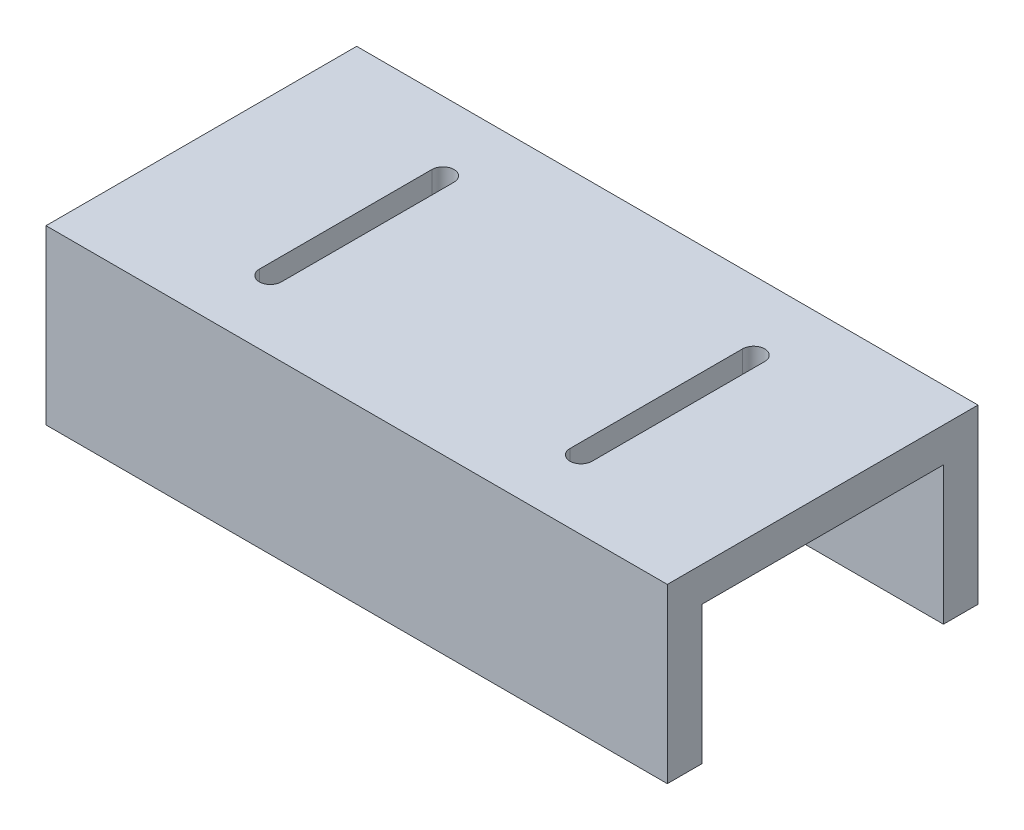
ISO-10303-21;
HEADER;
FILE_DESCRIPTION(('STEP AP214'),'2;1');
FILE_NAME('part.step','',(''),(''),'','','');
FILE_SCHEMA(('AUTOMOTIVE_DESIGN { 1 0 10303 214 1 1 1 1 }'));
ENDSEC;
DATA;
#1=APPLICATION_CONTEXT('core data for automotive mechanical design processes');
#2=APPLICATION_PROTOCOL_DEFINITION('international standard','automotive_design',2000,#1);
#3=PRODUCT_CONTEXT('',#1,'mechanical');
#4=PRODUCT('Part','Part','',(#3));
#5=PRODUCT_RELATED_PRODUCT_CATEGORY('part','',(#4));
#6=PRODUCT_DEFINITION_FORMATION('','',#4);
#7=PRODUCT_DEFINITION_CONTEXT('part definition',#1,'design');
#8=PRODUCT_DEFINITION('design','',#6,#7);
#9=PRODUCT_DEFINITION_SHAPE('','',#8);
#10=(LENGTH_UNIT() NAMED_UNIT(*) SI_UNIT(.MILLI.,.METRE.));
#11=(NAMED_UNIT(*) PLANE_ANGLE_UNIT() SI_UNIT($,.RADIAN.));
#12=(NAMED_UNIT(*) SI_UNIT($,.STERADIAN.) SOLID_ANGLE_UNIT());
#13=UNCERTAINTY_MEASURE_WITH_UNIT(LENGTH_MEASURE(1.E-05),#10,'distance_accuracy_value','');
#14=(GEOMETRIC_REPRESENTATION_CONTEXT(3) GLOBAL_UNCERTAINTY_ASSIGNED_CONTEXT((#13)) GLOBAL_UNIT_ASSIGNED_CONTEXT((#10,
#11,#12)) REPRESENTATION_CONTEXT('',''));
#15=CARTESIAN_POINT('',(0.,0.,0.));
#16=DIRECTION('',(0.,0.,1.));
#17=DIRECTION('',(1.,0.,0.));
#18=AXIS2_PLACEMENT_3D('',#15,#16,#17);
#19=CARTESIAN_POINT('',(25.,-1.5,3.));
#20=DIRECTION('',(0.,0.,1.));
#21=DIRECTION('',(1.,0.,0.));
#22=AXIS2_PLACEMENT_3D('',#19,#20,#21);
#23=PLANE('',#22);
#24=CARTESIAN_POINT('',(25.,-1.5,3.));
#25=DIRECTION('',(0.,0.,1.));
#26=DIRECTION('',(1.,0.,0.));
#27=AXIS2_PLACEMENT_3D('',#24,#25,#26);
#28=CIRCLE('',#27,1.6);
#29=CARTESIAN_POINT('',(26.6,-1.5,3.));
#30=VERTEX_POINT('',#29);
#31=EDGE_CURVE('E338',#30,#30,#28,.T.);
#32=ORIENTED_EDGE('',*,*,#31,.F.);
#33=EDGE_LOOP('',(#32));
#34=FACE_BOUND('',#33,.T.);
#35=CARTESIAN_POINT('',(25.,-1.5,3.));
#36=DIRECTION('',(0.,0.,1.));
#37=DIRECTION('',(1.,0.,0.));
#38=AXIS2_PLACEMENT_3D('',#35,#36,#37);
#39=CIRCLE('',#38,3.);
#40=CARTESIAN_POINT('',(28.,-1.5,3.));
#41=VERTEX_POINT('',#40);
#42=EDGE_CURVE('E34',#41,#41,#39,.T.);
#43=ORIENTED_EDGE('',*,*,#42,.T.);
#44=EDGE_LOOP('',(#43));
#45=FACE_BOUND('',#44,.T.);
#46=ADVANCED_FACE('F15',(#34,#45),#23,.T.);
#47=CARTESIAN_POINT('',(-25.,-1.5,3.));
#48=DIRECTION('',(0.,0.,1.));
#49=DIRECTION('',(1.,0.,0.));
#50=AXIS2_PLACEMENT_3D('',#47,#48,#49);
#51=PLANE('',#50);
#52=CARTESIAN_POINT('',(-25.,-1.5,3.));
#53=DIRECTION('',(0.,0.,1.));
#54=DIRECTION('',(1.,0.,0.));
#55=AXIS2_PLACEMENT_3D('',#52,#53,#54);
#56=CIRCLE('',#55,1.6);
#57=CARTESIAN_POINT('',(-23.4,-1.5,3.));
#58=VERTEX_POINT('',#57);
#59=EDGE_CURVE('E339',#58,#58,#56,.T.);
#60=ORIENTED_EDGE('',*,*,#59,.F.);
#61=EDGE_LOOP('',(#60));
#62=FACE_BOUND('',#61,.T.);
#63=CARTESIAN_POINT('',(-25.,-1.5,3.));
#64=DIRECTION('',(0.,0.,1.));
#65=DIRECTION('',(1.,0.,0.));
#66=AXIS2_PLACEMENT_3D('',#63,#64,#65);
#67=CIRCLE('',#66,3.);
#68=CARTESIAN_POINT('',(-22.,-1.5,3.));
#69=VERTEX_POINT('',#68);
#70=EDGE_CURVE('E41',#69,#69,#67,.T.);
#71=ORIENTED_EDGE('',*,*,#70,.T.);
#72=EDGE_LOOP('',(#71));
#73=FACE_BOUND('',#72,.T.);
#74=ADVANCED_FACE('F453',(#62,#73),#51,.T.);
#75=CARTESIAN_POINT('',(22.5,-12.5,35.));
#76=DIRECTION('',(0.,-1.,0.));
#77=DIRECTION('',(1.,0.,0.));
#78=AXIS2_PLACEMENT_3D('',#75,#76,#77);
#79=CYLINDRICAL_SURFACE('',#78,1.6);
#80=DIRECTION('',(0.,1.,0.));
#81=VECTOR('',#80,1.);
#82=CARTESIAN_POINT('',(20.9,-12.5,35.));
#83=LINE('',#82,#81);
#84=CARTESIAN_POINT('',(20.9,7.5,35.));
#85=VERTEX_POINT('',#84);
#86=CARTESIAN_POINT('',(20.9,12.5,35.));
#87=VERTEX_POINT('',#86);
#88=EDGE_CURVE('E10',#85,#87,#83,.T.);
#89=ORIENTED_EDGE('',*,*,#88,.T.);
#90=CARTESIAN_POINT('',(22.5,12.5,35.));
#91=DIRECTION('',(0.,-1.,0.));
#92=DIRECTION('',(1.,0.,0.));
#93=AXIS2_PLACEMENT_3D('',#90,#91,#92);
#94=CIRCLE('',#93,1.6);
#95=CARTESIAN_POINT('',(24.1,12.5,35.));
#96=VERTEX_POINT('',#95);
#97=EDGE_CURVE('E242',#96,#87,#94,.T.);
#98=ORIENTED_EDGE('',*,*,#97,.F.);
#99=DIRECTION('',(0.,1.,0.));
#100=VECTOR('',#99,1.);
#101=CARTESIAN_POINT('',(24.1,-12.5,35.));
#102=LINE('',#101,#100);
#103=CARTESIAN_POINT('',(24.1,7.5,35.));
#104=VERTEX_POINT('',#103);
#105=EDGE_CURVE('E410',#104,#96,#102,.T.);
#106=ORIENTED_EDGE('',*,*,#105,.F.);
#107=CARTESIAN_POINT('',(22.5,7.5,35.));
#108=DIRECTION('',(0.,-1.,0.));
#109=DIRECTION('',(1.,0.,0.));
#110=AXIS2_PLACEMENT_3D('',#107,#108,#109);
#111=CIRCLE('',#110,1.6);
#112=EDGE_CURVE('E269',#104,#85,#111,.T.);
#113=ORIENTED_EDGE('',*,*,#112,.T.);
#114=EDGE_LOOP('',(#89,#98,#106,#113));
#115=FACE_BOUND('',#114,.T.);
#116=ADVANCED_FACE('F432',(#115),#79,.F.);
#117=CARTESIAN_POINT('',(20.9,-12.5,35.));
#118=DIRECTION('',(-1.,0.,0.));
#119=DIRECTION('',(0.,0.,1.));
#120=AXIS2_PLACEMENT_3D('',#117,#118,#119);
#121=PLANE('',#120);
#122=DIRECTION('',(0.,1.,0.));
#123=VECTOR('',#122,1.);
#124=CARTESIAN_POINT('',(20.9,-12.5,10.));
#125=LINE('',#124,#123);
#126=CARTESIAN_POINT('',(20.9,7.5,10.));
#127=VERTEX_POINT('',#126);
#128=CARTESIAN_POINT('',(20.9,12.5,10.));
#129=VERTEX_POINT('',#128);
#130=EDGE_CURVE('E18',#127,#129,#125,.T.);
#131=ORIENTED_EDGE('',*,*,#130,.T.);
#132=DIRECTION('',(0.,0.,-1.));
#133=VECTOR('',#132,1.);
#134=CARTESIAN_POINT('',(20.9,12.5,17.5));
#135=LINE('',#134,#133);
#136=EDGE_CURVE('E361',#87,#129,#135,.T.);
#137=ORIENTED_EDGE('',*,*,#136,.F.);
#138=ORIENTED_EDGE('',*,*,#88,.F.);
#139=DIRECTION('',(0.,0.,1.));
#140=VECTOR('',#139,1.);
#141=CARTESIAN_POINT('',(20.9,7.5,28.75));
#142=LINE('',#141,#140);
#143=EDGE_CURVE('E274',#127,#85,#142,.T.);
#144=ORIENTED_EDGE('',*,*,#143,.F.);
#145=EDGE_LOOP('',(#131,#137,#138,#144));
#146=FACE_BOUND('',#145,.T.);
#147=ADVANCED_FACE('F423',(#146),#121,.F.);
#148=CARTESIAN_POINT('',(22.5,-12.5,10.));
#149=DIRECTION('',(0.,-1.,0.));
#150=DIRECTION('',(1.,0.,0.));
#151=AXIS2_PLACEMENT_3D('',#148,#149,#150);
#152=CYLINDRICAL_SURFACE('',#151,1.6);
#153=DIRECTION('',(0.,1.,0.));
#154=VECTOR('',#153,1.);
#155=CARTESIAN_POINT('',(24.1,-12.5,10.));
#156=LINE('',#155,#154);
#157=CARTESIAN_POINT('',(24.1,7.5,10.));
#158=VERTEX_POINT('',#157);
#159=CARTESIAN_POINT('',(24.1,12.5,10.));
#160=VERTEX_POINT('',#159);
#161=EDGE_CURVE('E412',#158,#160,#156,.T.);
#162=ORIENTED_EDGE('',*,*,#161,.T.);
#163=CARTESIAN_POINT('',(22.5,12.5,10.));
#164=DIRECTION('',(0.,-1.,0.));
#165=DIRECTION('',(1.,0.,0.));
#166=AXIS2_PLACEMENT_3D('',#163,#164,#165);
#167=CIRCLE('',#166,1.6);
#168=EDGE_CURVE('E365',#129,#160,#167,.T.);
#169=ORIENTED_EDGE('',*,*,#168,.F.);
#170=ORIENTED_EDGE('',*,*,#130,.F.);
#171=CARTESIAN_POINT('',(22.5,7.5,10.));
#172=DIRECTION('',(0.,-1.,0.));
#173=DIRECTION('',(1.,0.,0.));
#174=AXIS2_PLACEMENT_3D('',#171,#172,#173);
#175=CIRCLE('',#174,1.6);
#176=EDGE_CURVE('E282',#127,#158,#175,.T.);
#177=ORIENTED_EDGE('',*,*,#176,.T.);
#178=EDGE_LOOP('',(#162,#169,#170,#177));
#179=FACE_BOUND('',#178,.T.);
#180=ADVANCED_FACE('F425',(#179),#152,.F.);
#181=CARTESIAN_POINT('',(24.1,-12.5,35.));
#182=DIRECTION('',(-1.,0.,0.));
#183=DIRECTION('',(0.,0.,1.));
#184=AXIS2_PLACEMENT_3D('',#181,#182,#183);
#185=PLANE('',#184);
#186=DIRECTION('',(0.,0.,1.));
#187=VECTOR('',#186,1.);
#188=CARTESIAN_POINT('',(24.1,7.5,28.75));
#189=LINE('',#188,#187);
#190=EDGE_CURVE('E273',#158,#104,#189,.T.);
#191=ORIENTED_EDGE('',*,*,#190,.T.);
#192=ORIENTED_EDGE('',*,*,#105,.T.);
#193=DIRECTION('',(0.,0.,-1.));
#194=VECTOR('',#193,1.);
#195=CARTESIAN_POINT('',(24.1,12.5,17.5));
#196=LINE('',#195,#194);
#197=EDGE_CURVE('E369',#96,#160,#196,.T.);
#198=ORIENTED_EDGE('',*,*,#197,.T.);
#199=ORIENTED_EDGE('',*,*,#161,.F.);
#200=EDGE_LOOP('',(#191,#192,#198,#199));
#201=FACE_BOUND('',#200,.T.);
#202=ADVANCED_FACE('F439',(#201),#185,.T.);
#203=CARTESIAN_POINT('',(-22.5,-12.5,35.));
#204=DIRECTION('',(0.,-1.,0.));
#205=DIRECTION('',(1.,0.,0.));
#206=AXIS2_PLACEMENT_3D('',#203,#204,#205);
#207=CYLINDRICAL_SURFACE('',#206,1.6);
#208=DIRECTION('',(0.,1.,0.));
#209=VECTOR('',#208,1.);
#210=CARTESIAN_POINT('',(-24.1,-12.5,35.));
#211=LINE('',#210,#209);
#212=CARTESIAN_POINT('',(-24.1,7.5,35.));
#213=VERTEX_POINT('',#212);
#214=CARTESIAN_POINT('',(-24.1,12.5,35.));
#215=VERTEX_POINT('',#214);
#216=EDGE_CURVE('E407',#213,#215,#211,.T.);
#217=ORIENTED_EDGE('',*,*,#216,.T.);
#218=CARTESIAN_POINT('',(-22.5,12.5,35.));
#219=DIRECTION('',(0.,-1.,0.));
#220=DIRECTION('',(1.,0.,0.));
#221=AXIS2_PLACEMENT_3D('',#218,#219,#220);
#222=CIRCLE('',#221,1.6);
#223=CARTESIAN_POINT('',(-20.9,12.5,35.));
#224=VERTEX_POINT('',#223);
#225=EDGE_CURVE('E379',#224,#215,#222,.T.);
#226=ORIENTED_EDGE('',*,*,#225,.F.);
#227=DIRECTION('',(0.,1.,0.));
#228=VECTOR('',#227,1.);
#229=CARTESIAN_POINT('',(-20.9,-12.5,35.));
#230=LINE('',#229,#228);
#231=CARTESIAN_POINT('',(-20.9,7.5,35.));
#232=VERTEX_POINT('',#231);
#233=EDGE_CURVE('E398',#232,#224,#230,.T.);
#234=ORIENTED_EDGE('',*,*,#233,.F.);
#235=CARTESIAN_POINT('',(-22.5,7.5,35.));
#236=DIRECTION('',(0.,-1.,0.));
#237=DIRECTION('',(1.,0.,0.));
#238=AXIS2_PLACEMENT_3D('',#235,#236,#237);
#239=CIRCLE('',#238,1.6);
#240=EDGE_CURVE('E321',#232,#213,#239,.T.);
#241=ORIENTED_EDGE('',*,*,#240,.T.);
#242=EDGE_LOOP('',(#217,#226,#234,#241));
#243=FACE_BOUND('',#242,.T.);
#244=ADVANCED_FACE('F441',(#243),#207,.F.);
#245=CARTESIAN_POINT('',(-24.1,-12.5,35.));
#246=DIRECTION('',(-1.,0.,0.));
#247=DIRECTION('',(0.,0.,1.));
#248=AXIS2_PLACEMENT_3D('',#245,#246,#247);
#249=PLANE('',#248);
#250=DIRECTION('',(0.,1.,0.));
#251=VECTOR('',#250,1.);
#252=CARTESIAN_POINT('',(-24.1,-12.5,10.));
#253=LINE('',#252,#251);
#254=CARTESIAN_POINT('',(-24.1,7.5,10.));
#255=VERTEX_POINT('',#254);
#256=CARTESIAN_POINT('',(-24.1,12.5,10.));
#257=VERTEX_POINT('',#256);
#258=EDGE_CURVE('E404',#255,#257,#253,.T.);
#259=ORIENTED_EDGE('',*,*,#258,.T.);
#260=DIRECTION('',(0.,0.,-1.));
#261=VECTOR('',#260,1.);
#262=CARTESIAN_POINT('',(-24.1,12.5,17.5));
#263=LINE('',#262,#261);
#264=EDGE_CURVE('E237',#215,#257,#263,.T.);
#265=ORIENTED_EDGE('',*,*,#264,.F.);
#266=ORIENTED_EDGE('',*,*,#216,.F.);
#267=DIRECTION('',(0.,0.,1.));
#268=VECTOR('',#267,1.);
#269=CARTESIAN_POINT('',(-24.1,7.5,28.75));
#270=LINE('',#269,#268);
#271=EDGE_CURVE('E317',#255,#213,#270,.T.);
#272=ORIENTED_EDGE('',*,*,#271,.F.);
#273=EDGE_LOOP('',(#259,#265,#266,#272));
#274=FACE_BOUND('',#273,.T.);
#275=ADVANCED_FACE('F448',(#274),#249,.F.);
#276=CARTESIAN_POINT('',(-22.5,-12.5,10.));
#277=DIRECTION('',(0.,-1.,0.));
#278=DIRECTION('',(1.,0.,0.));
#279=AXIS2_PLACEMENT_3D('',#276,#277,#278);
#280=CYLINDRICAL_SURFACE('',#279,1.6);
#281=DIRECTION('',(0.,1.,0.));
#282=VECTOR('',#281,1.);
#283=CARTESIAN_POINT('',(-20.9,-12.5,10.));
#284=LINE('',#283,#282);
#285=CARTESIAN_POINT('',(-20.9,7.5,10.));
#286=VERTEX_POINT('',#285);
#287=CARTESIAN_POINT('',(-20.9,12.5,10.));
#288=VERTEX_POINT('',#287);
#289=EDGE_CURVE('E401',#286,#288,#284,.T.);
#290=ORIENTED_EDGE('',*,*,#289,.T.);
#291=CARTESIAN_POINT('',(-22.5,12.5,10.));
#292=DIRECTION('',(0.,-1.,0.));
#293=DIRECTION('',(1.,0.,0.));
#294=AXIS2_PLACEMENT_3D('',#291,#292,#293);
#295=CIRCLE('',#294,1.6);
#296=EDGE_CURVE('E241',#257,#288,#295,.T.);
#297=ORIENTED_EDGE('',*,*,#296,.F.);
#298=ORIENTED_EDGE('',*,*,#258,.F.);
#299=CARTESIAN_POINT('',(-22.5,7.5,10.));
#300=DIRECTION('',(0.,-1.,0.));
#301=DIRECTION('',(1.,0.,0.));
#302=AXIS2_PLACEMENT_3D('',#299,#300,#301);
#303=CIRCLE('',#302,1.6);
#304=EDGE_CURVE('E313',#255,#286,#303,.T.);
#305=ORIENTED_EDGE('',*,*,#304,.T.);
#306=EDGE_LOOP('',(#290,#297,#298,#305));
#307=FACE_BOUND('',#306,.T.);
#308=ADVANCED_FACE('F504',(#307),#280,.F.);
#309=CARTESIAN_POINT('',(-20.9,-12.5,35.));
#310=DIRECTION('',(-1.,0.,0.));
#311=DIRECTION('',(0.,0.,1.));
#312=AXIS2_PLACEMENT_3D('',#309,#310,#311);
#313=PLANE('',#312);
#314=DIRECTION('',(0.,0.,1.));
#315=VECTOR('',#314,1.);
#316=CARTESIAN_POINT('',(-20.9,7.5,28.75));
#317=LINE('',#316,#315);
#318=EDGE_CURVE('E286',#286,#232,#317,.T.);
#319=ORIENTED_EDGE('',*,*,#318,.T.);
#320=ORIENTED_EDGE('',*,*,#233,.T.);
#321=DIRECTION('',(0.,0.,-1.));
#322=VECTOR('',#321,1.);
#323=CARTESIAN_POINT('',(-20.9,12.5,17.5));
#324=LINE('',#323,#322);
#325=EDGE_CURVE('E281',#224,#288,#324,.T.);
#326=ORIENTED_EDGE('',*,*,#325,.T.);
#327=ORIENTED_EDGE('',*,*,#289,.F.);
#328=EDGE_LOOP('',(#319,#320,#326,#327));
#329=FACE_BOUND('',#328,.T.);
#330=ADVANCED_FACE('F502',(#329),#313,.T.);
#331=CARTESIAN_POINT('',(25.,-1.5,5.));
#332=DIRECTION('',(0.,0.,-1.));
#333=DIRECTION('',(1.,0.,0.));
#334=AXIS2_PLACEMENT_3D('',#331,#332,#333);
#335=CYLINDRICAL_SURFACE('',#334,3.);
#336=DIRECTION('',(0.,0.,-1.));
#337=VECTOR('',#336,1.);
#338=CARTESIAN_POINT('',(28.,-1.5,5.));
#339=LINE('',#338,#337);
#340=CARTESIAN_POINT('',(28.,-1.5,5.));
#341=VERTEX_POINT('',#340);
#342=EDGE_CURVE('E348',#341,#41,#339,.T.);
#343=ORIENTED_EDGE('',*,*,#342,.F.);
#344=CARTESIAN_POINT('',(25.,-1.5,5.));
#345=DIRECTION('',(0.,0.,1.));
#346=DIRECTION('',(1.,0.,0.));
#347=AXIS2_PLACEMENT_3D('',#344,#345,#346);
#348=CIRCLE('',#347,3.);
#349=EDGE_CURVE('E303',#341,#341,#348,.T.);
#350=ORIENTED_EDGE('',*,*,#349,.T.);
#351=ORIENTED_EDGE('',*,*,#342,.T.);
#352=ORIENTED_EDGE('',*,*,#42,.F.);
#353=EDGE_LOOP('',(#343,#350,#351,#352));
#354=FACE_BOUND('',#353,.T.);
#355=ADVANCED_FACE('F499',(#354),#335,.F.);
#356=CARTESIAN_POINT('',(-25.,-1.5,5.));
#357=DIRECTION('',(0.,0.,-1.));
#358=DIRECTION('',(1.,0.,0.));
#359=AXIS2_PLACEMENT_3D('',#356,#357,#358);
#360=CYLINDRICAL_SURFACE('',#359,3.);
#361=DIRECTION('',(0.,0.,-1.));
#362=VECTOR('',#361,1.);
#363=CARTESIAN_POINT('',(-22.,-1.5,5.));
#364=LINE('',#363,#362);
#365=CARTESIAN_POINT('',(-22.,-1.5,5.));
#366=VERTEX_POINT('',#365);
#367=EDGE_CURVE('E390',#366,#69,#364,.T.);
#368=ORIENTED_EDGE('',*,*,#367,.F.);
#369=CARTESIAN_POINT('',(-25.,-1.5,5.));
#370=DIRECTION('',(0.,0.,1.));
#371=DIRECTION('',(1.,0.,0.));
#372=AXIS2_PLACEMENT_3D('',#369,#370,#371);
#373=CIRCLE('',#372,3.);
#374=EDGE_CURVE('E300',#366,#366,#373,.T.);
#375=ORIENTED_EDGE('',*,*,#374,.T.);
#376=ORIENTED_EDGE('',*,*,#367,.T.);
#377=ORIENTED_EDGE('',*,*,#70,.F.);
#378=EDGE_LOOP('',(#368,#375,#376,#377));
#379=FACE_BOUND('',#378,.T.);
#380=ADVANCED_FACE('F482',(#379),#360,.F.);
#381=CARTESIAN_POINT('',(25.,-1.5,3.));
#382=DIRECTION('',(0.,0.,-1.));
#383=DIRECTION('',(1.,0.,0.));
#384=AXIS2_PLACEMENT_3D('',#381,#382,#383);
#385=CYLINDRICAL_SURFACE('',#384,1.6);
#386=DIRECTION('',(0.,0.,-1.));
#387=VECTOR('',#386,1.);
#388=CARTESIAN_POINT('',(26.6,-1.5,3.));
#389=LINE('',#388,#387);
#390=CARTESIAN_POINT('',(26.6,-1.5,0.));
#391=VERTEX_POINT('',#390);
#392=EDGE_CURVE('E335',#30,#391,#389,.T.);
#393=ORIENTED_EDGE('',*,*,#392,.F.);
#394=ORIENTED_EDGE('',*,*,#31,.T.);
#395=ORIENTED_EDGE('',*,*,#392,.T.);
#396=CARTESIAN_POINT('',(25.,-1.5,0.));
#397=DIRECTION('',(0.,0.,-1.));
#398=DIRECTION('',(1.,0.,0.));
#399=AXIS2_PLACEMENT_3D('',#396,#397,#398);
#400=CIRCLE('',#399,1.6);
#401=EDGE_CURVE('E264',#391,#391,#400,.T.);
#402=ORIENTED_EDGE('',*,*,#401,.T.);
#403=EDGE_LOOP('',(#393,#394,#395,#402));
#404=FACE_BOUND('',#403,.T.);
#405=ADVANCED_FACE('F462',(#404),#385,.F.);
#406=CARTESIAN_POINT('',(-25.,-1.5,3.));
#407=DIRECTION('',(0.,0.,-1.));
#408=DIRECTION('',(1.,0.,0.));
#409=AXIS2_PLACEMENT_3D('',#406,#407,#408);
#410=CYLINDRICAL_SURFACE('',#409,1.6);
#411=DIRECTION('',(0.,0.,-1.));
#412=VECTOR('',#411,1.);
#413=CARTESIAN_POINT('',(-23.4,-1.5,3.));
#414=LINE('',#413,#412);
#415=CARTESIAN_POINT('',(-23.4,-1.5,0.));
#416=VERTEX_POINT('',#415);
#417=EDGE_CURVE('E383',#58,#416,#414,.T.);
#418=ORIENTED_EDGE('',*,*,#417,.F.);
#419=ORIENTED_EDGE('',*,*,#59,.T.);
#420=ORIENTED_EDGE('',*,*,#417,.T.);
#421=CARTESIAN_POINT('',(-25.,-1.5,0.));
#422=DIRECTION('',(0.,0.,-1.));
#423=DIRECTION('',(1.,0.,0.));
#424=AXIS2_PLACEMENT_3D('',#421,#422,#423);
#425=CIRCLE('',#424,1.6);
#426=EDGE_CURVE('E209',#416,#416,#425,.T.);
#427=ORIENTED_EDGE('',*,*,#426,.T.);
#428=EDGE_LOOP('',(#418,#419,#420,#427));
#429=FACE_BOUND('',#428,.T.);
#430=ADVANCED_FACE('F471',(#429),#410,.F.);
#431=CARTESIAN_POINT('',(45.,-12.5,0.));
#432=DIRECTION('',(-1.,0.,0.));
#433=DIRECTION('',(0.,0.,1.));
#434=AXIS2_PLACEMENT_3D('',#431,#432,#433);
#435=PLANE('',#434);
#436=DIRECTION('',(0.,0.,1.));
#437=VECTOR('',#436,1.);
#438=CARTESIAN_POINT('',(45.,12.5,0.));
#439=LINE('',#438,#437);
#440=CARTESIAN_POINT('',(45.,12.5,0.));
#441=VERTEX_POINT('',#440);
#442=CARTESIAN_POINT('',(45.,12.5,45.));
#443=VERTEX_POINT('',#442);
#444=EDGE_CURVE('E358',#441,#443,#439,.T.);
#445=ORIENTED_EDGE('',*,*,#444,.T.);
#446=DIRECTION('',(0.,1.,0.));
#447=VECTOR('',#446,1.);
#448=CARTESIAN_POINT('',(45.,-12.5,45.));
#449=LINE('',#448,#447);
#450=CARTESIAN_POINT('',(45.,-12.5,45.));
#451=VERTEX_POINT('',#450);
#452=EDGE_CURVE('E347',#451,#443,#449,.T.);
#453=ORIENTED_EDGE('',*,*,#452,.F.);
#454=DIRECTION('',(0.,0.,1.));
#455=VECTOR('',#454,1.);
#456=CARTESIAN_POINT('',(45.,-12.5,0.));
#457=LINE('',#456,#455);
#458=CARTESIAN_POINT('',(45.,-12.5,40.));
#459=VERTEX_POINT('',#458);
#460=EDGE_CURVE('E291',#459,#451,#457,.T.);
#461=ORIENTED_EDGE('',*,*,#460,.F.);
#462=DIRECTION('',(0.,1.,0.));
#463=VECTOR('',#462,1.);
#464=CARTESIAN_POINT('',(45.,-12.5,40.));
#465=LINE('',#464,#463);
#466=CARTESIAN_POINT('',(45.,7.5,40.));
#467=VERTEX_POINT('',#466);
#468=EDGE_CURVE('E296',#459,#467,#465,.T.);
#469=ORIENTED_EDGE('',*,*,#468,.T.);
#470=DIRECTION('',(0.,0.,1.));
#471=VECTOR('',#470,1.);
#472=CARTESIAN_POINT('',(45.,7.5,5.));
#473=LINE('',#472,#471);
#474=CARTESIAN_POINT('',(45.,7.5,5.));
#475=VERTEX_POINT('',#474);
#476=EDGE_CURVE('E308',#475,#467,#473,.T.);
#477=ORIENTED_EDGE('',*,*,#476,.F.);
#478=DIRECTION('',(0.,1.,0.));
#479=VECTOR('',#478,1.);
#480=CARTESIAN_POINT('',(45.,-12.5,5.));
#481=LINE('',#480,#479);
#482=CARTESIAN_POINT('',(45.,-12.5,5.));
#483=VERTEX_POINT('',#482);
#484=EDGE_CURVE('E259',#483,#475,#481,.T.);
#485=ORIENTED_EDGE('',*,*,#484,.F.);
#486=DIRECTION('',(0.,0.,1.));
#487=VECTOR('',#486,1.);
#488=CARTESIAN_POINT('',(45.,-12.5,0.));
#489=LINE('',#488,#487);
#490=CARTESIAN_POINT('',(45.,-12.5,0.));
#491=VERTEX_POINT('',#490);
#492=EDGE_CURVE('E260',#491,#483,#489,.T.);
#493=ORIENTED_EDGE('',*,*,#492,.F.);
#494=DIRECTION('',(0.,1.,0.));
#495=VECTOR('',#494,1.);
#496=CARTESIAN_POINT('',(45.,-12.5,0.));
#497=LINE('',#496,#495);
#498=EDGE_CURVE('E204',#491,#441,#497,.T.);
#499=ORIENTED_EDGE('',*,*,#498,.T.);
#500=EDGE_LOOP('',(#445,#453,#461,#469,#477,#485,#493,#499));
#501=FACE_BOUND('',#500,.T.);
#502=ADVANCED_FACE('F474',(#501),#435,.F.);
#503=CARTESIAN_POINT('',(45.,12.5,0.));
#504=DIRECTION('',(0.,-1.,0.));
#505=DIRECTION('',(0.,0.,-1.));
#506=AXIS2_PLACEMENT_3D('',#503,#504,#505);
#507=PLANE('',#506);
#508=ORIENTED_EDGE('',*,*,#264,.T.);
#509=ORIENTED_EDGE('',*,*,#296,.T.);
#510=ORIENTED_EDGE('',*,*,#325,.F.);
#511=ORIENTED_EDGE('',*,*,#225,.T.);
#512=EDGE_LOOP('',(#508,#509,#510,#511));
#513=FACE_BOUND('',#512,.T.);
#514=ORIENTED_EDGE('',*,*,#136,.T.);
#515=ORIENTED_EDGE('',*,*,#168,.T.);
#516=ORIENTED_EDGE('',*,*,#197,.F.);
#517=ORIENTED_EDGE('',*,*,#97,.T.);
#518=EDGE_LOOP('',(#514,#515,#516,#517));
#519=FACE_BOUND('',#518,.T.);
#520=DIRECTION('',(-1.,0.,0.));
#521=VECTOR('',#520,1.);
#522=CARTESIAN_POINT('',(45.,12.5,0.));
#523=LINE('',#522,#521);
#524=CARTESIAN_POINT('',(-45.,12.5,0.));
#525=VERTEX_POINT('',#524);
#526=EDGE_CURVE('E220',#441,#525,#523,.T.);
#527=ORIENTED_EDGE('',*,*,#526,.T.);
#528=DIRECTION('',(0.,0.,1.));
#529=VECTOR('',#528,1.);
#530=CARTESIAN_POINT('',(-45.,12.5,0.));
#531=LINE('',#530,#529);
#532=CARTESIAN_POINT('',(-45.,12.5,45.));
#533=VERTEX_POINT('',#532);
#534=EDGE_CURVE('E218',#525,#533,#531,.T.);
#535=ORIENTED_EDGE('',*,*,#534,.T.);
#536=DIRECTION('',(-1.,0.,0.));
#537=VECTOR('',#536,1.);
#538=CARTESIAN_POINT('',(45.,12.5,45.));
#539=LINE('',#538,#537);
#540=EDGE_CURVE('E355',#443,#533,#539,.T.);
#541=ORIENTED_EDGE('',*,*,#540,.F.);
#542=ORIENTED_EDGE('',*,*,#444,.F.);
#543=EDGE_LOOP('',(#527,#535,#541,#542));
#544=FACE_BOUND('',#543,.T.);
#545=ADVANCED_FACE('F428',(#513,#519,#544),#507,.F.);
#546=CARTESIAN_POINT('',(0.,0.,45.));
#547=DIRECTION('',(0.,0.,1.));
#548=DIRECTION('',(1.,0.,0.));
#549=AXIS2_PLACEMENT_3D('',#546,#547,#548);
#550=PLANE('',#549);
#551=DIRECTION('',(0.,-1.,0.));
#552=VECTOR('',#551,1.);
#553=CARTESIAN_POINT('',(-45.,12.5,45.));
#554=LINE('',#553,#552);
#555=CARTESIAN_POINT('',(-45.,-12.5,45.));
#556=VERTEX_POINT('',#555);
#557=EDGE_CURVE('E243',#533,#556,#554,.T.);
#558=ORIENTED_EDGE('',*,*,#557,.T.);
#559=DIRECTION('',(1.,0.,0.));
#560=VECTOR('',#559,1.);
#561=CARTESIAN_POINT('',(-45.,-12.5,45.));
#562=LINE('',#561,#560);
#563=EDGE_CURVE('E295',#556,#451,#562,.T.);
#564=ORIENTED_EDGE('',*,*,#563,.T.);
#565=ORIENTED_EDGE('',*,*,#452,.T.);
#566=ORIENTED_EDGE('',*,*,#540,.T.);
#567=EDGE_LOOP('',(#558,#564,#565,#566));
#568=FACE_BOUND('',#567,.T.);
#569=ADVANCED_FACE('F494',(#568),#550,.T.);
#570=CARTESIAN_POINT('',(-45.,-12.5,0.));
#571=DIRECTION('',(0.,1.,0.));
#572=DIRECTION('',(1.,0.,0.));
#573=AXIS2_PLACEMENT_3D('',#570,#571,#572);
#574=PLANE('',#573);
#575=ORIENTED_EDGE('',*,*,#460,.T.);
#576=ORIENTED_EDGE('',*,*,#563,.F.);
#577=DIRECTION('',(0.,0.,1.));
#578=VECTOR('',#577,1.);
#579=CARTESIAN_POINT('',(-45.,-12.5,0.));
#580=LINE('',#579,#578);
#581=CARTESIAN_POINT('',(-45.,-12.5,40.));
#582=VERTEX_POINT('',#581);
#583=EDGE_CURVE('E247',#582,#556,#580,.T.);
#584=ORIENTED_EDGE('',*,*,#583,.F.);
#585=DIRECTION('',(-1.,0.,0.));
#586=VECTOR('',#585,1.);
#587=CARTESIAN_POINT('',(45.,-12.5,40.));
#588=LINE('',#587,#586);
#589=EDGE_CURVE('E334',#459,#582,#588,.T.);
#590=ORIENTED_EDGE('',*,*,#589,.F.);
#591=EDGE_LOOP('',(#575,#576,#584,#590));
#592=FACE_BOUND('',#591,.T.);
#593=ADVANCED_FACE('F489',(#592),#574,.F.);
#594=CARTESIAN_POINT('',(45.,-12.5,40.));
#595=DIRECTION('',(0.,0.,1.));
#596=DIRECTION('',(0.,-1.,0.));
#597=AXIS2_PLACEMENT_3D('',#594,#595,#596);
#598=PLANE('',#597);
#599=ORIENTED_EDGE('',*,*,#589,.T.);
#600=DIRECTION('',(0.,1.,0.));
#601=VECTOR('',#600,1.);
#602=CARTESIAN_POINT('',(-45.,-12.5,40.));
#603=LINE('',#602,#601);
#604=CARTESIAN_POINT('',(-45.,7.5,40.));
#605=VERTEX_POINT('',#604);
#606=EDGE_CURVE('E251',#582,#605,#603,.T.);
#607=ORIENTED_EDGE('',*,*,#606,.T.);
#608=DIRECTION('',(-1.,0.,0.));
#609=VECTOR('',#608,1.);
#610=CARTESIAN_POINT('',(45.,7.5,40.));
#611=LINE('',#610,#609);
#612=EDGE_CURVE('E312',#467,#605,#611,.T.);
#613=ORIENTED_EDGE('',*,*,#612,.F.);
#614=ORIENTED_EDGE('',*,*,#468,.F.);
#615=EDGE_LOOP('',(#599,#607,#613,#614));
#616=FACE_BOUND('',#615,.T.);
#617=ADVANCED_FACE('F487',(#616),#598,.F.);
#618=CARTESIAN_POINT('',(0.,7.5,22.5));
#619=DIRECTION('',(0.,1.,0.));
#620=DIRECTION('',(1.,0.,0.));
#621=AXIS2_PLACEMENT_3D('',#618,#619,#620);
#622=PLANE('',#621);
#623=ORIENTED_EDGE('',*,*,#176,.F.);
#624=ORIENTED_EDGE('',*,*,#143,.T.);
#625=ORIENTED_EDGE('',*,*,#112,.F.);
#626=ORIENTED_EDGE('',*,*,#190,.F.);
#627=EDGE_LOOP('',(#623,#624,#625,#626));
#628=FACE_BOUND('',#627,.T.);
#629=ORIENTED_EDGE('',*,*,#304,.F.);
#630=ORIENTED_EDGE('',*,*,#271,.T.);
#631=ORIENTED_EDGE('',*,*,#240,.F.);
#632=ORIENTED_EDGE('',*,*,#318,.F.);
#633=EDGE_LOOP('',(#629,#630,#631,#632));
#634=FACE_BOUND('',#633,.T.);
#635=DIRECTION('',(1.,0.,0.));
#636=VECTOR('',#635,1.);
#637=CARTESIAN_POINT('',(-45.,7.5,5.));
#638=LINE('',#637,#636);
#639=CARTESIAN_POINT('',(-45.,7.5,5.));
#640=VERTEX_POINT('',#639);
#641=EDGE_CURVE('E290',#640,#475,#638,.T.);
#642=ORIENTED_EDGE('',*,*,#641,.T.);
#643=ORIENTED_EDGE('',*,*,#476,.T.);
#644=ORIENTED_EDGE('',*,*,#612,.T.);
#645=DIRECTION('',(0.,0.,-1.));
#646=VECTOR('',#645,1.);
#647=CARTESIAN_POINT('',(-45.,7.5,40.));
#648=LINE('',#647,#646);
#649=EDGE_CURVE('E232',#605,#640,#648,.T.);
#650=ORIENTED_EDGE('',*,*,#649,.T.);
#651=EDGE_LOOP('',(#642,#643,#644,#650));
#652=FACE_BOUND('',#651,.T.);
#653=ADVANCED_FACE('F436',(#628,#634,#652),#622,.F.);
#654=CARTESIAN_POINT('',(-45.,-12.5,5.));
#655=DIRECTION('',(0.,0.,-1.));
#656=DIRECTION('',(0.,-1.,0.));
#657=AXIS2_PLACEMENT_3D('',#654,#655,#656);
#658=PLANE('',#657);
#659=ORIENTED_EDGE('',*,*,#349,.F.);
#660=EDGE_LOOP('',(#659));
#661=FACE_BOUND('',#660,.T.);
#662=ORIENTED_EDGE('',*,*,#374,.F.);
#663=EDGE_LOOP('',(#662));
#664=FACE_BOUND('',#663,.T.);
#665=DIRECTION('',(1.,0.,0.));
#666=VECTOR('',#665,1.);
#667=CARTESIAN_POINT('',(-45.,-12.5,5.));
#668=LINE('',#667,#666);
#669=CARTESIAN_POINT('',(-45.,-12.5,5.));
#670=VERTEX_POINT('',#669);
#671=EDGE_CURVE('E224',#670,#483,#668,.T.);
#672=ORIENTED_EDGE('',*,*,#671,.T.);
#673=ORIENTED_EDGE('',*,*,#484,.T.);
#674=ORIENTED_EDGE('',*,*,#641,.F.);
#675=DIRECTION('',(0.,1.,0.));
#676=VECTOR('',#675,1.);
#677=CARTESIAN_POINT('',(-45.,-12.5,5.));
#678=LINE('',#677,#676);
#679=EDGE_CURVE('E227',#670,#640,#678,.T.);
#680=ORIENTED_EDGE('',*,*,#679,.F.);
#681=EDGE_LOOP('',(#672,#673,#674,#680));
#682=FACE_BOUND('',#681,.T.);
#683=ADVANCED_FACE('F526',(#661,#664,#682),#658,.F.);
#684=CARTESIAN_POINT('',(-45.,-12.5,0.));
#685=DIRECTION('',(0.,1.,0.));
#686=DIRECTION('',(1.,0.,0.));
#687=AXIS2_PLACEMENT_3D('',#684,#685,#686);
#688=PLANE('',#687);
#689=ORIENTED_EDGE('',*,*,#492,.T.);
#690=ORIENTED_EDGE('',*,*,#671,.F.);
#691=DIRECTION('',(0.,0.,1.));
#692=VECTOR('',#691,1.);
#693=CARTESIAN_POINT('',(-45.,-12.5,0.));
#694=LINE('',#693,#692);
#695=CARTESIAN_POINT('',(-45.,-12.5,0.));
#696=VERTEX_POINT('',#695);
#697=EDGE_CURVE('E215',#696,#670,#694,.T.);
#698=ORIENTED_EDGE('',*,*,#697,.F.);
#699=DIRECTION('',(1.,0.,0.));
#700=VECTOR('',#699,1.);
#701=CARTESIAN_POINT('',(-45.,-12.5,0.));
#702=LINE('',#701,#700);
#703=EDGE_CURVE('E197',#696,#491,#702,.T.);
#704=ORIENTED_EDGE('',*,*,#703,.T.);
#705=EDGE_LOOP('',(#689,#690,#698,#704));
#706=FACE_BOUND('',#705,.T.);
#707=ADVANCED_FACE('F222',(#706),#688,.F.);
#708=CARTESIAN_POINT('',(0.,0.,0.));
#709=DIRECTION('',(0.,0.,1.));
#710=DIRECTION('',(1.,0.,0.));
#711=AXIS2_PLACEMENT_3D('',#708,#709,#710);
#712=PLANE('',#711);
#713=ORIENTED_EDGE('',*,*,#401,.F.);
#714=EDGE_LOOP('',(#713));
#715=FACE_BOUND('',#714,.T.);
#716=ORIENTED_EDGE('',*,*,#426,.F.);
#717=EDGE_LOOP('',(#716));
#718=FACE_BOUND('',#717,.T.);
#719=ORIENTED_EDGE('',*,*,#526,.F.);
#720=ORIENTED_EDGE('',*,*,#498,.F.);
#721=ORIENTED_EDGE('',*,*,#703,.F.);
#722=DIRECTION('',(0.,-1.,0.));
#723=VECTOR('',#722,1.);
#724=CARTESIAN_POINT('',(-45.,12.5,0.));
#725=LINE('',#724,#723);
#726=EDGE_CURVE('E201',#525,#696,#725,.T.);
#727=ORIENTED_EDGE('',*,*,#726,.F.);
#728=EDGE_LOOP('',(#719,#720,#721,#727));
#729=FACE_BOUND('',#728,.T.);
#730=ADVANCED_FACE('F200',(#715,#718,#729),#712,.F.);
#731=CARTESIAN_POINT('',(-45.,12.5,0.));
#732=DIRECTION('',(1.,0.,0.));
#733=DIRECTION('',(0.,1.,0.));
#734=AXIS2_PLACEMENT_3D('',#731,#732,#733);
#735=PLANE('',#734);
#736=ORIENTED_EDGE('',*,*,#697,.T.);
#737=ORIENTED_EDGE('',*,*,#679,.T.);
#738=ORIENTED_EDGE('',*,*,#649,.F.);
#739=ORIENTED_EDGE('',*,*,#606,.F.);
#740=ORIENTED_EDGE('',*,*,#583,.T.);
#741=ORIENTED_EDGE('',*,*,#557,.F.);
#742=ORIENTED_EDGE('',*,*,#534,.F.);
#743=ORIENTED_EDGE('',*,*,#726,.T.);
#744=EDGE_LOOP('',(#736,#737,#738,#739,#740,#741,#742,#743));
#745=FACE_BOUND('',#744,.T.);
#746=ADVANCED_FACE('F213',(#745),#735,.F.);
#747=CLOSED_SHELL('',(#46,#74,#116,#147,#180,#202,#244,#275,#308,#330,#355,#380,#405,#430,#502,
#545,#569,#593,#617,#653,#683,#707,#730,#746));
#748=MANIFOLD_SOLID_BREP('B1',#747);
#749=ADVANCED_BREP_SHAPE_REPRESENTATION('',(#18,#748),#14);
#750=SHAPE_DEFINITION_REPRESENTATION(#9,#749);
ENDSEC;
END-ISO-10303-21;
